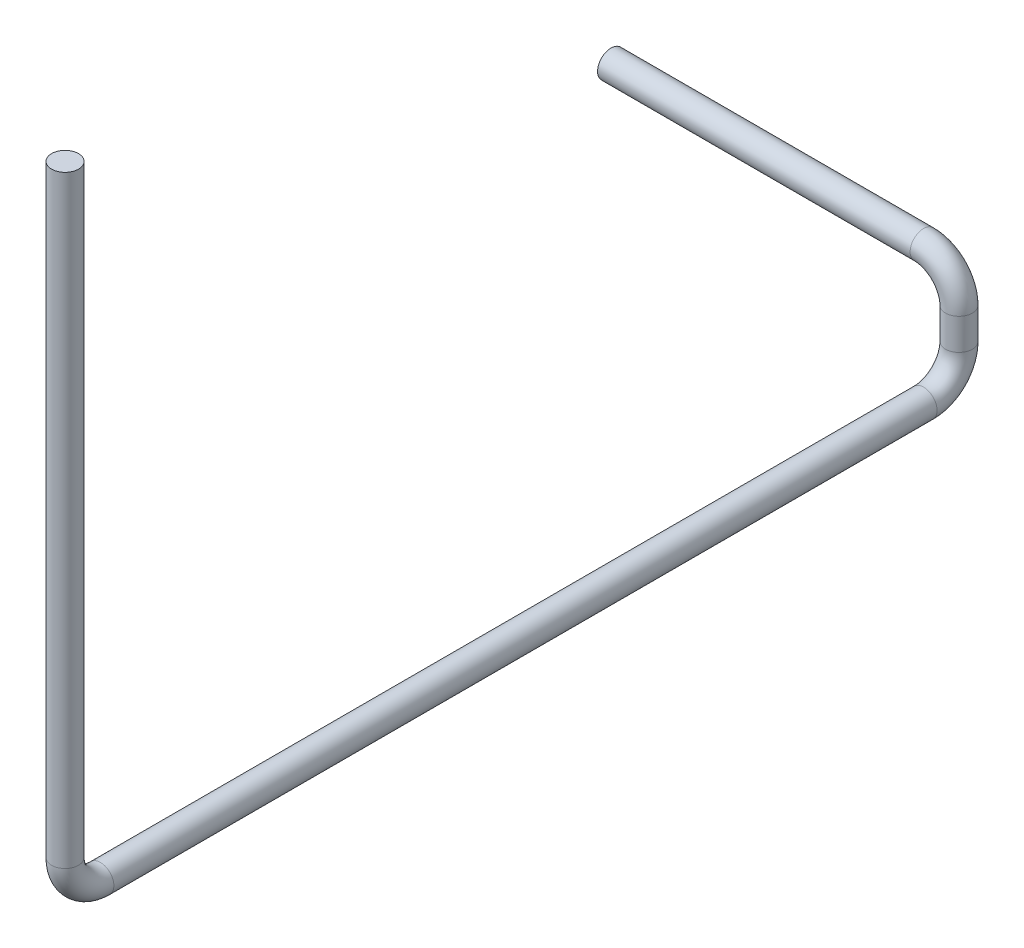
ISO-10303-21;
HEADER;
FILE_DESCRIPTION(('STEP AP214'),'2;1');
FILE_NAME('part.step','',(''),(''),'','','');
FILE_SCHEMA(('AUTOMOTIVE_DESIGN { 1 0 10303 214 1 1 1 1 }'));
ENDSEC;
DATA;
#1=APPLICATION_CONTEXT('core data for automotive mechanical design processes');
#2=APPLICATION_PROTOCOL_DEFINITION('international standard','automotive_design',2000,#1);
#3=PRODUCT_CONTEXT('',#1,'mechanical');
#4=PRODUCT('Part','Part','',(#3));
#5=PRODUCT_RELATED_PRODUCT_CATEGORY('part','',(#4));
#6=PRODUCT_DEFINITION_FORMATION('','',#4);
#7=PRODUCT_DEFINITION_CONTEXT('part definition',#1,'design');
#8=PRODUCT_DEFINITION('design','',#6,#7);
#9=PRODUCT_DEFINITION_SHAPE('','',#8);
#10=(LENGTH_UNIT() NAMED_UNIT(*) SI_UNIT(.MILLI.,.METRE.));
#11=(NAMED_UNIT(*) PLANE_ANGLE_UNIT() SI_UNIT($,.RADIAN.));
#12=(NAMED_UNIT(*) SI_UNIT($,.STERADIAN.) SOLID_ANGLE_UNIT());
#13=UNCERTAINTY_MEASURE_WITH_UNIT(LENGTH_MEASURE(1.E-05),#10,'distance_accuracy_value','');
#14=(GEOMETRIC_REPRESENTATION_CONTEXT(3) GLOBAL_UNCERTAINTY_ASSIGNED_CONTEXT((#13)) GLOBAL_UNIT_ASSIGNED_CONTEXT((#10,
#11,#12)) REPRESENTATION_CONTEXT('',''));
#15=CARTESIAN_POINT('',(0.,0.,0.));
#16=DIRECTION('',(0.,0.,1.));
#17=DIRECTION('',(1.,0.,0.));
#18=AXIS2_PLACEMENT_3D('',#15,#16,#17);
#19=CARTESIAN_POINT('',(1158.59003224347,-243.390046142145,2257.04999999998));
#20=DIRECTION('',(-1.,0.,0.));
#21=DIRECTION('',(0.,1.,0.));
#22=AXIS2_PLACEMENT_3D('',#19,#20,#21);
#23=PLANE('',#22);
#24=CARTESIAN_POINT('',(1158.59003224347,-243.390046142145,2257.04999999998));
#25=DIRECTION('',(-1.,0.,0.));
#26=DIRECTION('',(0.,1.,0.));
#27=AXIS2_PLACEMENT_3D('',#24,#25,#26);
#28=CIRCLE('',#27,19.05);
#29=CARTESIAN_POINT('',(1158.59003224347,-224.340046142145,2257.04999999998));
#30=VERTEX_POINT('',#29);
#31=EDGE_CURVE('E56',#30,#30,#28,.T.);
#32=ORIENTED_EDGE('',*,*,#31,.T.);
#33=EDGE_LOOP('',(#32));
#34=FACE_BOUND('',#33,.T.);
#35=ADVANCED_FACE('F44',(#34),#23,.T.);
#36=CARTESIAN_POINT('',(1650.47736651347,514.750220823855,3520.80586061879));
#37=DIRECTION('',(0.,-1.,0.));
#38=DIRECTION('',(1.,0.,0.));
#39=AXIS2_PLACEMENT_3D('',#36,#37,#38);
#40=PLANE('',#39);
#41=CARTESIAN_POINT('',(1650.47736651347,514.750220823855,3520.80586061879));
#42=DIRECTION('',(0.,-1.,0.));
#43=DIRECTION('',(1.,0.,0.));
#44=AXIS2_PLACEMENT_3D('',#41,#42,#43);
#45=CIRCLE('',#44,19.05);
#46=CARTESIAN_POINT('',(1669.52736651347,514.750220823855,3520.80586061879));
#47=VERTEX_POINT('',#46);
#48=EDGE_CURVE('E12',#47,#47,#45,.T.);
#49=ORIENTED_EDGE('',*,*,#48,.F.);
#50=EDGE_LOOP('',(#49));
#51=FACE_BOUND('',#50,.T.);
#52=ADVANCED_FACE('F62',(#51),#40,.F.);
#53=CARTESIAN_POINT('',(1158.59003224347,-243.390046142145,2257.04999999998));
#54=DIRECTION('',(1.,0.,0.));
#55=DIRECTION('',(0.,0.,-1.));
#56=AXIS2_PLACEMENT_3D('',#53,#54,#55);
#57=CYLINDRICAL_SURFACE('',#56,19.05);
#58=CARTESIAN_POINT('',(1600.47736651347,-243.390046142145,2257.04999999998));
#59=DIRECTION('',(-1.,0.,0.));
#60=DIRECTION('',(0.,1.,0.));
#61=AXIS2_PLACEMENT_3D('',#58,#59,#60);
#62=CIRCLE('',#61,19.05);
#63=CARTESIAN_POINT('',(1600.47736651347,-224.340046142145,2257.04999999998));
#64=VERTEX_POINT('',#63);
#65=EDGE_CURVE('E104',#64,#64,#62,.T.);
#66=ORIENTED_EDGE('',*,*,#65,.T.);
#67=EDGE_LOOP('',(#66));
#68=FACE_BOUND('',#67,.T.);
#69=ORIENTED_EDGE('',*,*,#31,.F.);
#70=EDGE_LOOP('',(#69));
#71=FACE_BOUND('',#70,.T.);
#72=ADVANCED_FACE('F64',(#68,#71),#57,.T.);
#73=CARTESIAN_POINT('',(1600.47736651347,-293.390046142145,2257.04999999998));
#74=DIRECTION('',(0.,0.,-1.));
#75=DIRECTION('',(-1.,0.,0.));
#76=AXIS2_PLACEMENT_3D('',#73,#74,#75);
#77=TOROIDAL_SURFACE('',#76,49.9999999999997,19.05);
#78=CARTESIAN_POINT('',(1650.47736651347,-293.390046142145,2257.04999999998));
#79=DIRECTION('',(0.,1.,0.));
#80=DIRECTION('',(1.,0.,0.));
#81=AXIS2_PLACEMENT_3D('',#78,#79,#80);
#82=CIRCLE('',#81,19.05);
#83=CARTESIAN_POINT('',(1669.52736651347,-293.390046142145,2257.04999999998));
#84=VERTEX_POINT('',#83);
#85=EDGE_CURVE('E101',#84,#84,#82,.T.);
#86=CARTESIAN_POINT('',(1600.47736651347,-293.390046142145,2257.04999999998));
#87=DIRECTION('',(0.,0.,-1.));
#88=DIRECTION('',(-1.,0.,0.));
#89=AXIS2_PLACEMENT_3D('',#86,#87,#88);
#90=CIRCLE('',#89,69.0499999999997);
#91=EDGE_CURVE('',#64,#84,#90,.T.);
#92=ORIENTED_EDGE('',*,*,#65,.F.);
#93=ORIENTED_EDGE('',*,*,#85,.T.);
#94=ORIENTED_EDGE('',*,*,#91,.T.);
#95=ORIENTED_EDGE('',*,*,#91,.F.);
#96=EDGE_LOOP('',(#92,#94,#93,#95));
#97=FACE_BOUND('',#96,.T.);
#98=ADVANCED_FACE('F69',(#97),#77,.T.);
#99=CARTESIAN_POINT('',(1650.47736651347,-293.390046142145,2257.04999999998));
#100=DIRECTION('',(0.,-1.,0.));
#101=DIRECTION('',(0.,0.,-1.));
#102=AXIS2_PLACEMENT_3D('',#99,#100,#101);
#103=CYLINDRICAL_SURFACE('',#102,19.05);
#104=CARTESIAN_POINT('',(1650.47736651347,-337.599174545866,2257.04999999998));
#105=DIRECTION('',(0.,1.,0.));
#106=DIRECTION('',(1.,0.,0.));
#107=AXIS2_PLACEMENT_3D('',#104,#105,#106);
#108=CIRCLE('',#107,19.05);
#109=CARTESIAN_POINT('',(1650.47736651347,-337.599174545866,2237.99999999997));
#110=VERTEX_POINT('',#109);
#111=EDGE_CURVE('E106',#110,#110,#108,.T.);
#112=ORIENTED_EDGE('',*,*,#111,.T.);
#113=EDGE_LOOP('',(#112));
#114=FACE_BOUND('',#113,.T.);
#115=ORIENTED_EDGE('',*,*,#85,.F.);
#116=EDGE_LOOP('',(#115));
#117=FACE_BOUND('',#116,.T.);
#118=ADVANCED_FACE('F89',(#114,#117),#103,.T.);
#119=CARTESIAN_POINT('',(1650.47736651347,-337.599174545866,2307.04999999998));
#120=DIRECTION('',(-1.,0.,0.));
#121=DIRECTION('',(0.,0.,1.));
#122=AXIS2_PLACEMENT_3D('',#119,#120,#121);
#123=TOROIDAL_SURFACE('',#122,50.0000000000003,19.05);
#124=CARTESIAN_POINT('',(1650.47736651347,-387.599174545866,2307.04999999998));
#125=DIRECTION('',(0.,0.,-1.));
#126=DIRECTION('',(1.,0.,0.));
#127=AXIS2_PLACEMENT_3D('',#124,#125,#126);
#128=CIRCLE('',#127,19.05);
#129=CARTESIAN_POINT('',(1650.47736651347,-406.649174545867,2307.04999999998));
#130=VERTEX_POINT('',#129);
#131=EDGE_CURVE('E112',#130,#130,#128,.T.);
#132=CARTESIAN_POINT('',(1650.47736651347,-337.599174545866,2307.04999999998));
#133=DIRECTION('',(-1.,0.,0.));
#134=DIRECTION('',(0.,0.,1.));
#135=AXIS2_PLACEMENT_3D('',#132,#133,#134);
#136=CIRCLE('',#135,69.0500000000003);
#137=EDGE_CURVE('',#110,#130,#136,.T.);
#138=ORIENTED_EDGE('',*,*,#111,.F.);
#139=ORIENTED_EDGE('',*,*,#131,.T.);
#140=ORIENTED_EDGE('',*,*,#137,.T.);
#141=ORIENTED_EDGE('',*,*,#137,.F.);
#142=EDGE_LOOP('',(#138,#140,#139,#141));
#143=FACE_BOUND('',#142,.T.);
#144=ADVANCED_FACE('F85',(#143),#123,.T.);
#145=CARTESIAN_POINT('',(1650.47736651347,-387.599174545866,2307.04999999998));
#146=DIRECTION('',(0.,0.,1.));
#147=DIRECTION('',(1.,0.,0.));
#148=AXIS2_PLACEMENT_3D('',#145,#146,#147);
#149=CYLINDRICAL_SURFACE('',#148,19.05);
#150=CARTESIAN_POINT('',(1650.47736651347,-387.599174545866,3470.80586061879));
#151=DIRECTION('',(0.,0.,-1.));
#152=DIRECTION('',(1.,0.,0.));
#153=AXIS2_PLACEMENT_3D('',#150,#151,#152);
#154=CIRCLE('',#153,19.05);
#155=CARTESIAN_POINT('',(1650.47736651347,-406.649174545866,3470.80586061879));
#156=VERTEX_POINT('',#155);
#157=EDGE_CURVE('E115',#156,#156,#154,.T.);
#158=ORIENTED_EDGE('',*,*,#157,.T.);
#159=EDGE_LOOP('',(#158));
#160=FACE_BOUND('',#159,.T.);
#161=ORIENTED_EDGE('',*,*,#131,.F.);
#162=EDGE_LOOP('',(#161));
#163=FACE_BOUND('',#162,.T.);
#164=ADVANCED_FACE('F79',(#160,#163),#149,.T.);
#165=CARTESIAN_POINT('',(1650.47736651347,-337.599174545866,3470.80586061879));
#166=DIRECTION('',(-1.,0.,0.));
#167=DIRECTION('',(0.,0.,1.));
#168=AXIS2_PLACEMENT_3D('',#165,#166,#167);
#169=TOROIDAL_SURFACE('',#168,50.,19.05);
#170=CARTESIAN_POINT('',(1650.47736651347,-337.599174545866,3520.80586061879));
#171=DIRECTION('',(0.,-1.,0.));
#172=DIRECTION('',(1.,0.,0.));
#173=AXIS2_PLACEMENT_3D('',#170,#171,#172);
#174=CIRCLE('',#173,19.05);
#175=CARTESIAN_POINT('',(1650.47736651347,-337.599174545866,3539.85586061879));
#176=VERTEX_POINT('',#175);
#177=EDGE_CURVE('E51',#176,#176,#174,.T.);
#178=CARTESIAN_POINT('',(1650.47736651347,-337.599174545866,3470.80586061879));
#179=DIRECTION('',(-1.,0.,0.));
#180=DIRECTION('',(0.,0.,1.));
#181=AXIS2_PLACEMENT_3D('',#178,#179,#180);
#182=CIRCLE('',#181,69.0500000000001);
#183=EDGE_CURVE('',#156,#176,#182,.T.);
#184=ORIENTED_EDGE('',*,*,#157,.F.);
#185=ORIENTED_EDGE('',*,*,#177,.T.);
#186=ORIENTED_EDGE('',*,*,#183,.T.);
#187=ORIENTED_EDGE('',*,*,#183,.F.);
#188=EDGE_LOOP('',(#184,#186,#185,#187));
#189=FACE_BOUND('',#188,.T.);
#190=ADVANCED_FACE('F75',(#189),#169,.T.);
#191=CARTESIAN_POINT('',(1650.47736651347,-337.599174545866,3520.80586061879));
#192=DIRECTION('',(0.,1.,0.));
#193=DIRECTION('',(-1.,0.,0.));
#194=AXIS2_PLACEMENT_3D('',#191,#192,#193);
#195=CYLINDRICAL_SURFACE('',#194,19.05);
#196=ORIENTED_EDGE('',*,*,#48,.T.);
#197=EDGE_LOOP('',(#196));
#198=FACE_BOUND('',#197,.T.);
#199=ORIENTED_EDGE('',*,*,#177,.F.);
#200=EDGE_LOOP('',(#199));
#201=FACE_BOUND('',#200,.T.);
#202=ADVANCED_FACE('F59',(#198,#201),#195,.T.);
#203=CLOSED_SHELL('',(#35,#52,#72,#98,#118,#144,#164,#190,#202));
#204=MANIFOLD_SOLID_BREP('B2',#203);
#205=ADVANCED_BREP_SHAPE_REPRESENTATION('',(#18,#204),#14);
#206=SHAPE_DEFINITION_REPRESENTATION(#9,#205);
ENDSEC;
END-ISO-10303-21;
